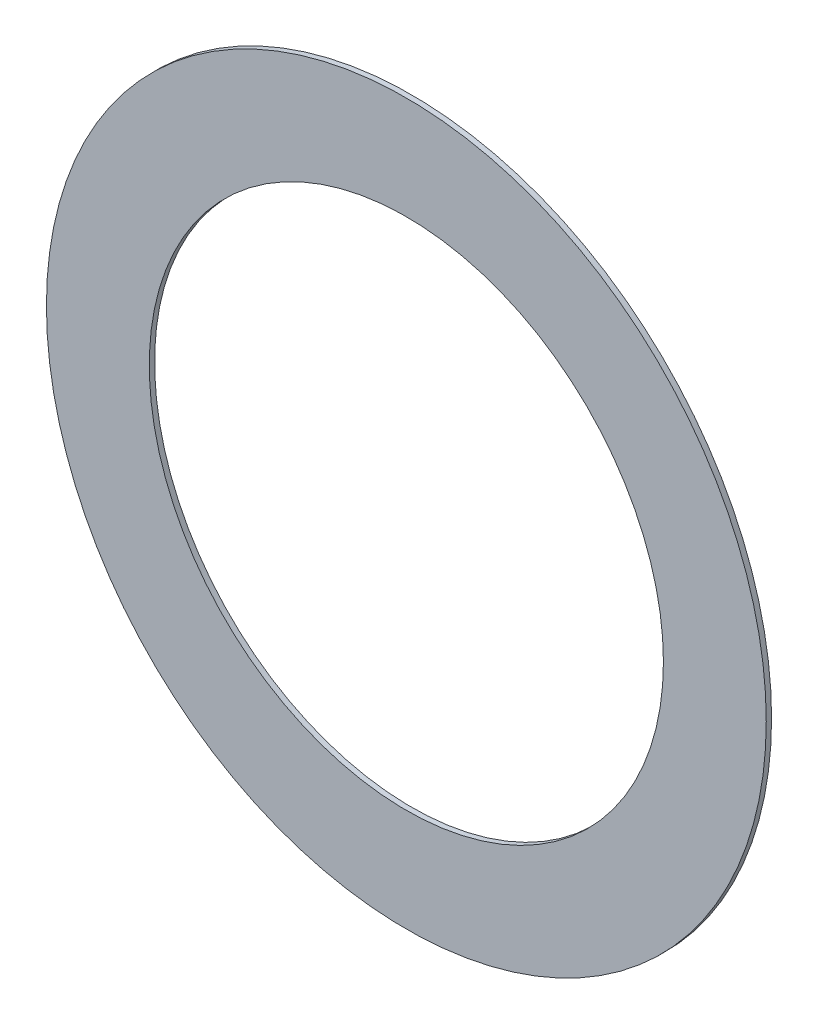
ISO-10303-21;
HEADER;
FILE_DESCRIPTION(('STEP AP214'),'2;1');
FILE_NAME('part.step','',(''),(''),'','','');
FILE_SCHEMA(('AUTOMOTIVE_DESIGN { 1 0 10303 214 1 1 1 1 }'));
ENDSEC;
DATA;
#1=APPLICATION_CONTEXT('core data for automotive mechanical design processes');
#2=APPLICATION_PROTOCOL_DEFINITION('international standard','automotive_design',2000,#1);
#3=PRODUCT_CONTEXT('',#1,'mechanical');
#4=PRODUCT('Part','Part','',(#3));
#5=PRODUCT_RELATED_PRODUCT_CATEGORY('part','',(#4));
#6=PRODUCT_DEFINITION_FORMATION('','',#4);
#7=PRODUCT_DEFINITION_CONTEXT('part definition',#1,'design');
#8=PRODUCT_DEFINITION('design','',#6,#7);
#9=PRODUCT_DEFINITION_SHAPE('','',#8);
#10=(LENGTH_UNIT() NAMED_UNIT(*) SI_UNIT(.MILLI.,.METRE.));
#11=(NAMED_UNIT(*) PLANE_ANGLE_UNIT() SI_UNIT($,.RADIAN.));
#12=(NAMED_UNIT(*) SI_UNIT($,.STERADIAN.) SOLID_ANGLE_UNIT());
#13=UNCERTAINTY_MEASURE_WITH_UNIT(LENGTH_MEASURE(1.E-05),#10,'distance_accuracy_value','');
#14=(GEOMETRIC_REPRESENTATION_CONTEXT(3) GLOBAL_UNCERTAINTY_ASSIGNED_CONTEXT((#13)) GLOBAL_UNIT_ASSIGNED_CONTEXT((#10,
#11,#12)) REPRESENTATION_CONTEXT('',''));
#15=CARTESIAN_POINT('',(0.,0.,0.));
#16=DIRECTION('',(0.,0.,1.));
#17=DIRECTION('',(1.,0.,0.));
#18=AXIS2_PLACEMENT_3D('',#15,#16,#17);
#19=CARTESIAN_POINT('',(0.,0.,3.));
#20=DIRECTION('',(0.,0.,1.));
#21=DIRECTION('',(1.,0.,0.));
#22=AXIS2_PLACEMENT_3D('',#19,#20,#21);
#23=PLANE('',#22);
#24=CARTESIAN_POINT('',(0.,0.,3.));
#25=DIRECTION('',(0.,0.,1.));
#26=DIRECTION('',(1.,0.,0.));
#27=AXIS2_PLACEMENT_3D('',#24,#25,#26);
#28=CIRCLE('',#27,203.);
#29=CARTESIAN_POINT('',(203.,0.,3.));
#30=VERTEX_POINT('',#29);
#31=EDGE_CURVE('E10',#30,#30,#28,.T.);
#32=ORIENTED_EDGE('',*,*,#31,.T.);
#33=EDGE_LOOP('',(#32));
#34=FACE_BOUND('',#33,.T.);
#35=CARTESIAN_POINT('',(0.,0.,3.));
#36=DIRECTION('',(0.,0.,1.));
#37=DIRECTION('',(1.,0.,0.));
#38=AXIS2_PLACEMENT_3D('',#35,#36,#37);
#39=CIRCLE('',#38,145.);
#40=CARTESIAN_POINT('',(145.,0.,3.));
#41=VERTEX_POINT('',#40);
#42=EDGE_CURVE('E48',#41,#41,#39,.T.);
#43=ORIENTED_EDGE('',*,*,#42,.F.);
#44=EDGE_LOOP('',(#43));
#45=FACE_BOUND('',#44,.T.);
#46=ADVANCED_FACE('F37',(#34,#45),#23,.T.);
#47=CARTESIAN_POINT('',(0.,0.,0.));
#48=DIRECTION('',(0.,0.,1.));
#49=DIRECTION('',(1.,0.,0.));
#50=AXIS2_PLACEMENT_3D('',#47,#48,#49);
#51=PLANE('',#50);
#52=CARTESIAN_POINT('',(0.,0.,0.));
#53=DIRECTION('',(0.,0.,1.));
#54=DIRECTION('',(1.,0.,0.));
#55=AXIS2_PLACEMENT_3D('',#52,#53,#54);
#56=CIRCLE('',#55,203.);
#57=CARTESIAN_POINT('',(203.,0.,0.));
#58=VERTEX_POINT('',#57);
#59=EDGE_CURVE('E41',#58,#58,#56,.T.);
#60=ORIENTED_EDGE('',*,*,#59,.F.);
#61=EDGE_LOOP('',(#60));
#62=FACE_BOUND('',#61,.T.);
#63=CARTESIAN_POINT('',(0.,0.,0.));
#64=DIRECTION('',(0.,0.,1.));
#65=DIRECTION('',(1.,0.,0.));
#66=AXIS2_PLACEMENT_3D('',#63,#64,#65);
#67=CIRCLE('',#66,145.);
#68=CARTESIAN_POINT('',(145.,0.,0.));
#69=VERTEX_POINT('',#68);
#70=EDGE_CURVE('E50',#69,#69,#67,.T.);
#71=ORIENTED_EDGE('',*,*,#70,.T.);
#72=EDGE_LOOP('',(#71));
#73=FACE_BOUND('',#72,.T.);
#74=ADVANCED_FACE('F60',(#62,#73),#51,.F.);
#75=CARTESIAN_POINT('',(0.,0.,3.));
#76=DIRECTION('',(0.,0.,-1.));
#77=DIRECTION('',(-1.,0.,0.));
#78=AXIS2_PLACEMENT_3D('',#75,#76,#77);
#79=CYLINDRICAL_SURFACE('',#78,203.);
#80=ORIENTED_EDGE('',*,*,#31,.F.);
#81=EDGE_LOOP('',(#80));
#82=FACE_BOUND('',#81,.T.);
#83=ORIENTED_EDGE('',*,*,#59,.T.);
#84=EDGE_LOOP('',(#83));
#85=FACE_BOUND('',#84,.T.);
#86=ADVANCED_FACE('F39',(#82,#85),#79,.T.);
#87=CARTESIAN_POINT('',(0.,0.,3.));
#88=DIRECTION('',(0.,0.,-1.));
#89=DIRECTION('',(-1.,0.,0.));
#90=AXIS2_PLACEMENT_3D('',#87,#88,#89);
#91=CYLINDRICAL_SURFACE('',#90,145.);
#92=ORIENTED_EDGE('',*,*,#42,.T.);
#93=EDGE_LOOP('',(#92));
#94=FACE_BOUND('',#93,.T.);
#95=ORIENTED_EDGE('',*,*,#70,.F.);
#96=EDGE_LOOP('',(#95));
#97=FACE_BOUND('',#96,.T.);
#98=ADVANCED_FACE('F56',(#94,#97),#91,.F.);
#99=CLOSED_SHELL('',(#46,#74,#86,#98));
#100=MANIFOLD_SOLID_BREP('B2',#99);
#101=ADVANCED_BREP_SHAPE_REPRESENTATION('',(#18,#100),#14);
#102=SHAPE_DEFINITION_REPRESENTATION(#9,#101);
ENDSEC;
END-ISO-10303-21;
